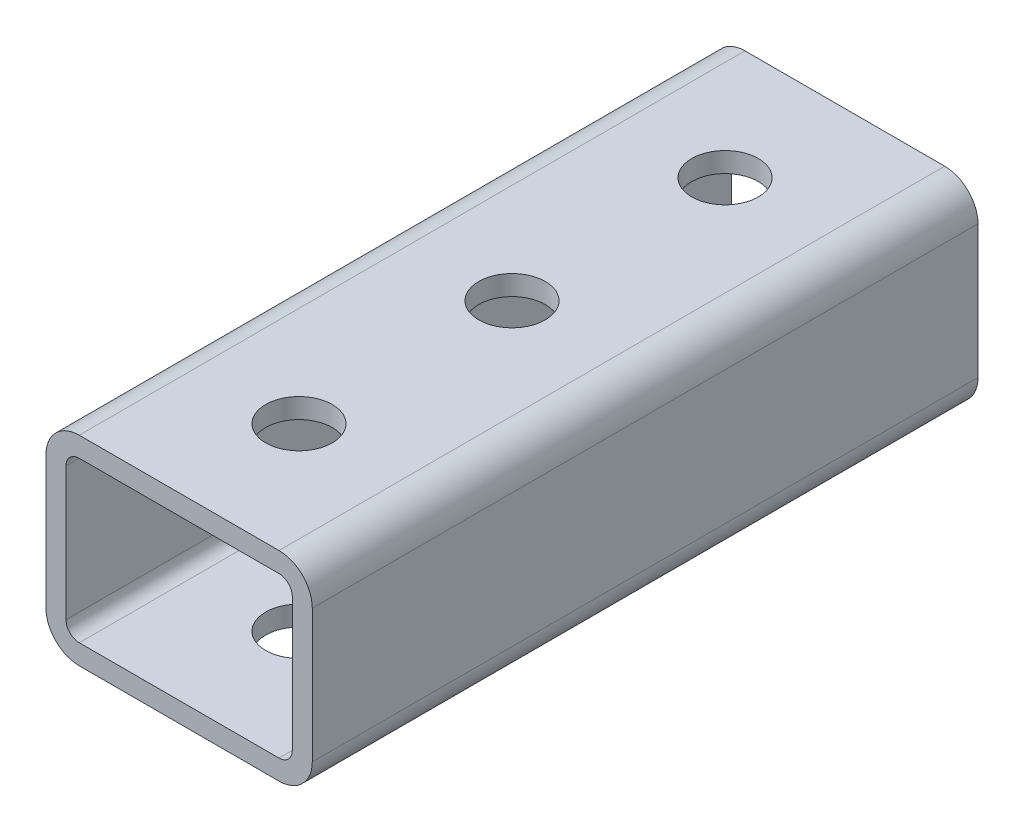
ISO-10303-21;
HEADER;
FILE_DESCRIPTION(('STEP AP214'),'2;1');
FILE_NAME('part.step','',(''),(''),'','','');
FILE_SCHEMA(('AUTOMOTIVE_DESIGN { 1 0 10303 214 1 1 1 1 }'));
ENDSEC;
DATA;
#1=APPLICATION_CONTEXT('core data for automotive mechanical design processes');
#2=APPLICATION_PROTOCOL_DEFINITION('international standard','automotive_design',2000,#1);
#3=PRODUCT_CONTEXT('',#1,'mechanical');
#4=PRODUCT('Part','Part','',(#3));
#5=PRODUCT_RELATED_PRODUCT_CATEGORY('part','',(#4));
#6=PRODUCT_DEFINITION_FORMATION('','',#4);
#7=PRODUCT_DEFINITION_CONTEXT('part definition',#1,'design');
#8=PRODUCT_DEFINITION('design','',#6,#7);
#9=PRODUCT_DEFINITION_SHAPE('','',#8);
#10=(LENGTH_UNIT() NAMED_UNIT(*) SI_UNIT(.MILLI.,.METRE.));
#11=(NAMED_UNIT(*) PLANE_ANGLE_UNIT() SI_UNIT($,.RADIAN.));
#12=(NAMED_UNIT(*) SI_UNIT($,.STERADIAN.) SOLID_ANGLE_UNIT());
#13=UNCERTAINTY_MEASURE_WITH_UNIT(LENGTH_MEASURE(1.E-05),#10,'distance_accuracy_value','');
#14=(GEOMETRIC_REPRESENTATION_CONTEXT(3) GLOBAL_UNCERTAINTY_ASSIGNED_CONTEXT((#13)) GLOBAL_UNIT_ASSIGNED_CONTEXT((#10,
#11,#12)) REPRESENTATION_CONTEXT('',''));
#15=CARTESIAN_POINT('',(0.,0.,0.));
#16=DIRECTION('',(0.,0.,1.));
#17=DIRECTION('',(1.,0.,0.));
#18=AXIS2_PLACEMENT_3D('',#15,#16,#17);
#19=CARTESIAN_POINT('',(10.,-40.9016994374947,9.));
#20=DIRECTION('',(0.,1.,0.));
#21=DIRECTION('',(-1.,0.,0.));
#22=AXIS2_PLACEMENT_3D('',#19,#20,#21);
#23=CYLINDRICAL_SURFACE('',#22,2.5);
#24=CARTESIAN_POINT('',(10.,1.5,9.));
#25=DIRECTION('',(0.,1.,0.));
#26=DIRECTION('',(-1.,0.,0.));
#27=AXIS2_PLACEMENT_3D('',#24,#25,#26);
#28=CIRCLE('',#27,2.5);
#29=CARTESIAN_POINT('',(7.50000000000001,1.5,9.));
#30=VERTEX_POINT('',#29);
#31=EDGE_CURVE('E225',#30,#30,#28,.T.);
#32=ORIENTED_EDGE('',*,*,#31,.T.);
#33=EDGE_LOOP('',(#32));
#34=FACE_BOUND('',#33,.T.);
#35=CARTESIAN_POINT('',(10.,0.,9.));
#36=DIRECTION('',(0.,1.,0.));
#37=DIRECTION('',(-1.,0.,0.));
#38=AXIS2_PLACEMENT_3D('',#35,#36,#37);
#39=CIRCLE('',#38,2.5);
#40=CARTESIAN_POINT('',(7.50000000000001,0.,9.));
#41=VERTEX_POINT('',#40);
#42=EDGE_CURVE('E228',#41,#41,#39,.T.);
#43=ORIENTED_EDGE('',*,*,#42,.F.);
#44=EDGE_LOOP('',(#43));
#45=FACE_BOUND('',#44,.T.);
#46=ADVANCED_FACE('F17',(#34,#45),#23,.F.);
#47=CARTESIAN_POINT('',(10.,-40.9016994374947,25.));
#48=DIRECTION('',(0.,1.,0.));
#49=DIRECTION('',(-1.,0.,0.));
#50=AXIS2_PLACEMENT_3D('',#47,#48,#49);
#51=CYLINDRICAL_SURFACE('',#50,2.5);
#52=CARTESIAN_POINT('',(10.,1.5,25.));
#53=DIRECTION('',(0.,1.,0.));
#54=DIRECTION('',(-1.,0.,0.));
#55=AXIS2_PLACEMENT_3D('',#52,#53,#54);
#56=CIRCLE('',#55,2.5);
#57=CARTESIAN_POINT('',(7.50000000000001,1.5,25.));
#58=VERTEX_POINT('',#57);
#59=EDGE_CURVE('E273',#58,#58,#56,.T.);
#60=ORIENTED_EDGE('',*,*,#59,.T.);
#61=EDGE_LOOP('',(#60));
#62=FACE_BOUND('',#61,.T.);
#63=CARTESIAN_POINT('',(10.,0.,25.));
#64=DIRECTION('',(0.,1.,0.));
#65=DIRECTION('',(-1.,0.,0.));
#66=AXIS2_PLACEMENT_3D('',#63,#64,#65);
#67=CIRCLE('',#66,2.5);
#68=CARTESIAN_POINT('',(7.50000000000001,0.,25.));
#69=VERTEX_POINT('',#68);
#70=EDGE_CURVE('E280',#69,#69,#67,.T.);
#71=ORIENTED_EDGE('',*,*,#70,.F.);
#72=EDGE_LOOP('',(#71));
#73=FACE_BOUND('',#72,.T.);
#74=ADVANCED_FACE('F473',(#62,#73),#51,.F.);
#75=CARTESIAN_POINT('',(10.,-40.9016994374947,41.));
#76=DIRECTION('',(0.,1.,0.));
#77=DIRECTION('',(-1.,0.,0.));
#78=AXIS2_PLACEMENT_3D('',#75,#76,#77);
#79=CYLINDRICAL_SURFACE('',#78,2.5);
#80=CARTESIAN_POINT('',(10.,1.5,41.));
#81=DIRECTION('',(0.,1.,0.));
#82=DIRECTION('',(-1.,0.,0.));
#83=AXIS2_PLACEMENT_3D('',#80,#81,#82);
#84=CIRCLE('',#83,2.5);
#85=CARTESIAN_POINT('',(7.50000000000001,1.5,41.));
#86=VERTEX_POINT('',#85);
#87=EDGE_CURVE('E146',#86,#86,#84,.T.);
#88=ORIENTED_EDGE('',*,*,#87,.T.);
#89=EDGE_LOOP('',(#88));
#90=FACE_BOUND('',#89,.T.);
#91=CARTESIAN_POINT('',(10.,0.,41.));
#92=DIRECTION('',(0.,1.,0.));
#93=DIRECTION('',(-1.,0.,0.));
#94=AXIS2_PLACEMENT_3D('',#91,#92,#93);
#95=CIRCLE('',#94,2.5);
#96=CARTESIAN_POINT('',(7.50000000000001,0.,41.));
#97=VERTEX_POINT('',#96);
#98=EDGE_CURVE('E223',#97,#97,#95,.T.);
#99=ORIENTED_EDGE('',*,*,#98,.F.);
#100=EDGE_LOOP('',(#99));
#101=FACE_BOUND('',#100,.T.);
#102=ADVANCED_FACE('F466',(#90,#101),#79,.F.);
#103=CARTESIAN_POINT('',(2.50000000000001,2.5,0.));
#104=DIRECTION('',(0.,0.,1.));
#105=DIRECTION('',(1.,0.,0.));
#106=AXIS2_PLACEMENT_3D('',#103,#104,#105);
#107=CYLINDRICAL_SURFACE('',#106,1.);
#108=DIRECTION('',(0.,0.,1.));
#109=VECTOR('',#108,1.);
#110=CARTESIAN_POINT('',(1.50000000000001,2.5,0.));
#111=LINE('',#110,#109);
#112=CARTESIAN_POINT('',(1.50000000000001,2.5,0.));
#113=VERTEX_POINT('',#112);
#114=CARTESIAN_POINT('',(1.50000000000001,2.5,50.));
#115=VERTEX_POINT('',#114);
#116=EDGE_CURVE('E140',#113,#115,#111,.T.);
#117=ORIENTED_EDGE('',*,*,#116,.T.);
#118=CARTESIAN_POINT('',(2.50000000000001,2.5,50.));
#119=DIRECTION('',(0.,0.,1.));
#120=DIRECTION('',(1.,0.,0.));
#121=AXIS2_PLACEMENT_3D('',#118,#119,#120);
#122=CIRCLE('',#121,1.);
#123=CARTESIAN_POINT('',(2.50000000000001,1.5,50.));
#124=VERTEX_POINT('',#123);
#125=EDGE_CURVE('E20',#124,#115,#122,.F.);
#126=ORIENTED_EDGE('',*,*,#125,.F.);
#127=DIRECTION('',(0.,0.,-1.));
#128=VECTOR('',#127,1.);
#129=CARTESIAN_POINT('',(2.50000000000001,1.5,0.));
#130=LINE('',#129,#128);
#131=CARTESIAN_POINT('',(2.50000000000001,1.5,0.));
#132=VERTEX_POINT('',#131);
#133=EDGE_CURVE('E222',#124,#132,#130,.T.);
#134=ORIENTED_EDGE('',*,*,#133,.T.);
#135=CARTESIAN_POINT('',(2.50000000000001,2.5,0.));
#136=DIRECTION('',(0.,0.,1.));
#137=DIRECTION('',(1.,0.,0.));
#138=AXIS2_PLACEMENT_3D('',#135,#136,#137);
#139=CIRCLE('',#138,1.);
#140=EDGE_CURVE('E138',#113,#132,#139,.T.);
#141=ORIENTED_EDGE('',*,*,#140,.F.);
#142=EDGE_LOOP('',(#117,#126,#134,#141));
#143=FACE_BOUND('',#142,.T.);
#144=ADVANCED_FACE('F141',(#143),#107,.F.);
#145=CARTESIAN_POINT('',(17.5,2.5,0.));
#146=DIRECTION('',(0.,0.,1.));
#147=DIRECTION('',(1.,0.,0.));
#148=AXIS2_PLACEMENT_3D('',#145,#146,#147);
#149=CYLINDRICAL_SURFACE('',#148,1.);
#150=DIRECTION('',(0.,0.,-1.));
#151=VECTOR('',#150,1.);
#152=CARTESIAN_POINT('',(17.5,1.5,0.));
#153=LINE('',#152,#151);
#154=CARTESIAN_POINT('',(17.5,1.5,0.));
#155=VERTEX_POINT('',#154);
#156=CARTESIAN_POINT('',(17.5,1.5,50.));
#157=VERTEX_POINT('',#156);
#158=EDGE_CURVE('E219',#155,#157,#153,.F.);
#159=ORIENTED_EDGE('',*,*,#158,.T.);
#160=CARTESIAN_POINT('',(17.5,2.5,50.));
#161=DIRECTION('',(0.,0.,1.));
#162=DIRECTION('',(1.,0.,0.));
#163=AXIS2_PLACEMENT_3D('',#160,#161,#162);
#164=CIRCLE('',#163,1.);
#165=CARTESIAN_POINT('',(18.5,2.5,50.));
#166=VERTEX_POINT('',#165);
#167=EDGE_CURVE('E286',#166,#157,#164,.F.);
#168=ORIENTED_EDGE('',*,*,#167,.F.);
#169=DIRECTION('',(0.,0.,-1.));
#170=VECTOR('',#169,1.);
#171=CARTESIAN_POINT('',(18.5,2.5,0.));
#172=LINE('',#171,#170);
#173=CARTESIAN_POINT('',(18.5,2.5,0.));
#174=VERTEX_POINT('',#173);
#175=EDGE_CURVE('E145',#166,#174,#172,.T.);
#176=ORIENTED_EDGE('',*,*,#175,.T.);
#177=CARTESIAN_POINT('',(17.5,2.5,0.));
#178=DIRECTION('',(0.,0.,1.));
#179=DIRECTION('',(1.,0.,0.));
#180=AXIS2_PLACEMENT_3D('',#177,#178,#179);
#181=CIRCLE('',#180,1.);
#182=EDGE_CURVE('E240',#155,#174,#181,.T.);
#183=ORIENTED_EDGE('',*,*,#182,.F.);
#184=EDGE_LOOP('',(#159,#168,#176,#183));
#185=FACE_BOUND('',#184,.T.);
#186=ADVANCED_FACE('F295',(#185),#149,.F.);
#187=CARTESIAN_POINT('',(17.5,2.5,0.));
#188=DIRECTION('',(0.,0.,1.));
#189=DIRECTION('',(1.,0.,0.));
#190=AXIS2_PLACEMENT_3D('',#187,#188,#189);
#191=CYLINDRICAL_SURFACE('',#190,2.5);
#192=CARTESIAN_POINT('',(17.5,2.5,0.));
#193=DIRECTION('',(0.,0.,1.));
#194=DIRECTION('',(1.,0.,0.));
#195=AXIS2_PLACEMENT_3D('',#192,#193,#194);
#196=CIRCLE('',#195,2.5);
#197=CARTESIAN_POINT('',(17.5,0.,0.));
#198=VERTEX_POINT('',#197);
#199=CARTESIAN_POINT('',(20.,2.5,0.));
#200=VERTEX_POINT('',#199);
#201=EDGE_CURVE('E193',#198,#200,#196,.T.);
#202=ORIENTED_EDGE('',*,*,#201,.T.);
#203=DIRECTION('',(0.,0.,-1.));
#204=VECTOR('',#203,1.);
#205=CARTESIAN_POINT('',(20.,2.5,0.));
#206=LINE('',#205,#204);
#207=CARTESIAN_POINT('',(20.,2.5,50.));
#208=VERTEX_POINT('',#207);
#209=EDGE_CURVE('E239',#208,#200,#206,.T.);
#210=ORIENTED_EDGE('',*,*,#209,.F.);
#211=CARTESIAN_POINT('',(17.5,2.5,50.));
#212=DIRECTION('',(0.,0.,1.));
#213=DIRECTION('',(1.,0.,0.));
#214=AXIS2_PLACEMENT_3D('',#211,#212,#213);
#215=CIRCLE('',#214,2.5);
#216=CARTESIAN_POINT('',(17.5,0.,50.));
#217=VERTEX_POINT('',#216);
#218=EDGE_CURVE('E171',#217,#208,#215,.T.);
#219=ORIENTED_EDGE('',*,*,#218,.F.);
#220=DIRECTION('',(0.,0.,-1.));
#221=VECTOR('',#220,1.);
#222=CARTESIAN_POINT('',(17.5,0.,0.));
#223=LINE('',#222,#221);
#224=EDGE_CURVE('E229',#198,#217,#223,.F.);
#225=ORIENTED_EDGE('',*,*,#224,.F.);
#226=EDGE_LOOP('',(#202,#210,#219,#225));
#227=FACE_BOUND('',#226,.T.);
#228=ADVANCED_FACE('F445',(#227),#191,.T.);
#229=CARTESIAN_POINT('',(20.,15.,0.));
#230=DIRECTION('',(1.,0.,0.));
#231=DIRECTION('',(0.,0.,-1.));
#232=AXIS2_PLACEMENT_3D('',#229,#230,#231);
#233=PLANE('',#232);
#234=DIRECTION('',(0.,0.,1.));
#235=VECTOR('',#234,1.);
#236=CARTESIAN_POINT('',(20.,12.5,0.));
#237=LINE('',#236,#235);
#238=CARTESIAN_POINT('',(20.,12.5,50.));
#239=VERTEX_POINT('',#238);
#240=CARTESIAN_POINT('',(20.,12.5,0.));
#241=VERTEX_POINT('',#240);
#242=EDGE_CURVE('E235',#239,#241,#237,.F.);
#243=ORIENTED_EDGE('',*,*,#242,.F.);
#244=DIRECTION('',(0.,1.,0.));
#245=VECTOR('',#244,1.);
#246=CARTESIAN_POINT('',(20.,7.5,50.));
#247=LINE('',#246,#245);
#248=EDGE_CURVE('E169',#208,#239,#247,.T.);
#249=ORIENTED_EDGE('',*,*,#248,.F.);
#250=ORIENTED_EDGE('',*,*,#209,.T.);
#251=DIRECTION('',(0.,1.,0.));
#252=VECTOR('',#251,1.);
#253=CARTESIAN_POINT('',(20.,7.5,0.));
#254=LINE('',#253,#252);
#255=EDGE_CURVE('E206',#200,#241,#254,.T.);
#256=ORIENTED_EDGE('',*,*,#255,.T.);
#257=EDGE_LOOP('',(#243,#249,#250,#256));
#258=FACE_BOUND('',#257,.T.);
#259=ADVANCED_FACE('F437',(#258),#233,.T.);
#260=CARTESIAN_POINT('',(17.5,12.5,0.));
#261=DIRECTION('',(0.,0.,1.));
#262=DIRECTION('',(1.,0.,0.));
#263=AXIS2_PLACEMENT_3D('',#260,#261,#262);
#264=CYLINDRICAL_SURFACE('',#263,2.5);
#265=CARTESIAN_POINT('',(17.5,12.5,0.));
#266=DIRECTION('',(0.,0.,1.));
#267=DIRECTION('',(1.,0.,0.));
#268=AXIS2_PLACEMENT_3D('',#265,#266,#267);
#269=CIRCLE('',#268,2.5);
#270=CARTESIAN_POINT('',(17.5,15.,0.));
#271=VERTEX_POINT('',#270);
#272=EDGE_CURVE('E205',#241,#271,#269,.T.);
#273=ORIENTED_EDGE('',*,*,#272,.T.);
#274=DIRECTION('',(0.,0.,1.));
#275=VECTOR('',#274,1.);
#276=CARTESIAN_POINT('',(17.5,15.,0.));
#277=LINE('',#276,#275);
#278=CARTESIAN_POINT('',(17.5,15.,50.));
#279=VERTEX_POINT('',#278);
#280=EDGE_CURVE('E216',#279,#271,#277,.F.);
#281=ORIENTED_EDGE('',*,*,#280,.F.);
#282=CARTESIAN_POINT('',(17.5,12.5,50.));
#283=DIRECTION('',(0.,0.,1.));
#284=DIRECTION('',(1.,0.,0.));
#285=AXIS2_PLACEMENT_3D('',#282,#283,#284);
#286=CIRCLE('',#285,2.5);
#287=EDGE_CURVE('E168',#239,#279,#286,.T.);
#288=ORIENTED_EDGE('',*,*,#287,.F.);
#289=ORIENTED_EDGE('',*,*,#242,.T.);
#290=EDGE_LOOP('',(#273,#281,#288,#289));
#291=FACE_BOUND('',#290,.T.);
#292=ADVANCED_FACE('F429',(#291),#264,.T.);
#293=CARTESIAN_POINT('',(2.5,12.5,0.));
#294=DIRECTION('',(0.,0.,1.));
#295=DIRECTION('',(1.,0.,0.));
#296=AXIS2_PLACEMENT_3D('',#293,#294,#295);
#297=CYLINDRICAL_SURFACE('',#296,2.5);
#298=CARTESIAN_POINT('',(2.5,12.5,0.));
#299=DIRECTION('',(0.,0.,1.));
#300=DIRECTION('',(1.,0.,0.));
#301=AXIS2_PLACEMENT_3D('',#298,#299,#300);
#302=CIRCLE('',#301,2.5);
#303=CARTESIAN_POINT('',(2.5,15.,0.));
#304=VERTEX_POINT('',#303);
#305=CARTESIAN_POINT('',(0.,12.5,0.));
#306=VERTEX_POINT('',#305);
#307=EDGE_CURVE('E201',#304,#306,#302,.T.);
#308=ORIENTED_EDGE('',*,*,#307,.T.);
#309=DIRECTION('',(0.,0.,1.));
#310=VECTOR('',#309,1.);
#311=CARTESIAN_POINT('',(0.,12.5,0.));
#312=LINE('',#311,#310);
#313=CARTESIAN_POINT('',(0.,12.5,50.));
#314=VERTEX_POINT('',#313);
#315=EDGE_CURVE('E233',#314,#306,#312,.F.);
#316=ORIENTED_EDGE('',*,*,#315,.F.);
#317=CARTESIAN_POINT('',(2.5,12.5,50.));
#318=DIRECTION('',(0.,0.,1.));
#319=DIRECTION('',(1.,0.,0.));
#320=AXIS2_PLACEMENT_3D('',#317,#318,#319);
#321=CIRCLE('',#320,2.5);
#322=CARTESIAN_POINT('',(2.5,15.,50.));
#323=VERTEX_POINT('',#322);
#324=EDGE_CURVE('E164',#323,#314,#321,.T.);
#325=ORIENTED_EDGE('',*,*,#324,.F.);
#326=DIRECTION('',(0.,0.,1.));
#327=VECTOR('',#326,1.);
#328=CARTESIAN_POINT('',(2.5,15.,0.));
#329=LINE('',#328,#327);
#330=EDGE_CURVE('E209',#304,#323,#329,.T.);
#331=ORIENTED_EDGE('',*,*,#330,.F.);
#332=EDGE_LOOP('',(#308,#316,#325,#331));
#333=FACE_BOUND('',#332,.T.);
#334=ADVANCED_FACE('F421',(#333),#297,.T.);
#335=CARTESIAN_POINT('',(0.,0.,0.));
#336=DIRECTION('',(-1.,0.,0.));
#337=DIRECTION('',(0.,0.,1.));
#338=AXIS2_PLACEMENT_3D('',#335,#336,#337);
#339=PLANE('',#338);
#340=ORIENTED_EDGE('',*,*,#315,.T.);
#341=DIRECTION('',(0.,1.,0.));
#342=VECTOR('',#341,1.);
#343=CARTESIAN_POINT('',(0.,7.5,0.));
#344=LINE('',#343,#342);
#345=CARTESIAN_POINT('',(0.,2.5,0.));
#346=VERTEX_POINT('',#345);
#347=EDGE_CURVE('E198',#306,#346,#344,.F.);
#348=ORIENTED_EDGE('',*,*,#347,.T.);
#349=DIRECTION('',(0.,0.,1.));
#350=VECTOR('',#349,1.);
#351=CARTESIAN_POINT('',(0.,2.5,0.));
#352=LINE('',#351,#350);
#353=CARTESIAN_POINT('',(0.,2.5,50.));
#354=VERTEX_POINT('',#353);
#355=EDGE_CURVE('E231',#354,#346,#352,.F.);
#356=ORIENTED_EDGE('',*,*,#355,.F.);
#357=DIRECTION('',(0.,1.,0.));
#358=VECTOR('',#357,1.);
#359=CARTESIAN_POINT('',(0.,7.5,50.));
#360=LINE('',#359,#358);
#361=EDGE_CURVE('E162',#314,#354,#360,.F.);
#362=ORIENTED_EDGE('',*,*,#361,.F.);
#363=EDGE_LOOP('',(#340,#348,#356,#362));
#364=FACE_BOUND('',#363,.T.);
#365=ADVANCED_FACE('F413',(#364),#339,.T.);
#366=CARTESIAN_POINT('',(2.5,2.5,0.));
#367=DIRECTION('',(0.,0.,1.));
#368=DIRECTION('',(1.,0.,0.));
#369=AXIS2_PLACEMENT_3D('',#366,#367,#368);
#370=CYLINDRICAL_SURFACE('',#369,2.5);
#371=CARTESIAN_POINT('',(2.5,2.5,0.));
#372=DIRECTION('',(0.,0.,1.));
#373=DIRECTION('',(1.,0.,0.));
#374=AXIS2_PLACEMENT_3D('',#371,#372,#373);
#375=CIRCLE('',#374,2.5);
#376=CARTESIAN_POINT('',(2.5,0.,0.));
#377=VERTEX_POINT('',#376);
#378=EDGE_CURVE('E197',#346,#377,#375,.T.);
#379=ORIENTED_EDGE('',*,*,#378,.T.);
#380=DIRECTION('',(0.,0.,-1.));
#381=VECTOR('',#380,1.);
#382=CARTESIAN_POINT('',(2.5,0.,0.));
#383=LINE('',#382,#381);
#384=CARTESIAN_POINT('',(2.5,0.,50.));
#385=VERTEX_POINT('',#384);
#386=EDGE_CURVE('E226',#385,#377,#383,.T.);
#387=ORIENTED_EDGE('',*,*,#386,.F.);
#388=CARTESIAN_POINT('',(2.5,2.5,50.));
#389=DIRECTION('',(0.,0.,1.));
#390=DIRECTION('',(1.,0.,0.));
#391=AXIS2_PLACEMENT_3D('',#388,#389,#390);
#392=CIRCLE('',#391,2.5);
#393=EDGE_CURVE('E161',#354,#385,#392,.T.);
#394=ORIENTED_EDGE('',*,*,#393,.F.);
#395=ORIENTED_EDGE('',*,*,#355,.T.);
#396=EDGE_LOOP('',(#379,#387,#394,#395));
#397=FACE_BOUND('',#396,.T.);
#398=ADVANCED_FACE('F405',(#397),#370,.T.);
#399=CARTESIAN_POINT('',(20.,0.,0.));
#400=DIRECTION('',(0.,-1.,0.));
#401=DIRECTION('',(0.,0.,-1.));
#402=AXIS2_PLACEMENT_3D('',#399,#400,#401);
#403=PLANE('',#402);
#404=ORIENTED_EDGE('',*,*,#98,.T.);
#405=EDGE_LOOP('',(#404));
#406=FACE_BOUND('',#405,.T.);
#407=ORIENTED_EDGE('',*,*,#70,.T.);
#408=EDGE_LOOP('',(#407));
#409=FACE_BOUND('',#408,.T.);
#410=ORIENTED_EDGE('',*,*,#42,.T.);
#411=EDGE_LOOP('',(#410));
#412=FACE_BOUND('',#411,.T.);
#413=ORIENTED_EDGE('',*,*,#386,.T.);
#414=DIRECTION('',(1.,0.,0.));
#415=VECTOR('',#414,1.);
#416=CARTESIAN_POINT('',(10.,0.,0.));
#417=LINE('',#416,#415);
#418=EDGE_CURVE('E194',#377,#198,#417,.T.);
#419=ORIENTED_EDGE('',*,*,#418,.T.);
#420=ORIENTED_EDGE('',*,*,#224,.T.);
#421=DIRECTION('',(1.,0.,0.));
#422=VECTOR('',#421,1.);
#423=CARTESIAN_POINT('',(10.,0.,50.));
#424=LINE('',#423,#422);
#425=EDGE_CURVE('E155',#385,#217,#424,.T.);
#426=ORIENTED_EDGE('',*,*,#425,.F.);
#427=EDGE_LOOP('',(#413,#419,#420,#426));
#428=FACE_BOUND('',#427,.T.);
#429=ADVANCED_FACE('F397',(#406,#409,#412,#428),#403,.T.);
#430=CARTESIAN_POINT('',(18.5,1.5,0.));
#431=DIRECTION('',(0.,-1.,0.));
#432=DIRECTION('',(0.,0.,-1.));
#433=AXIS2_PLACEMENT_3D('',#430,#431,#432);
#434=PLANE('',#433);
#435=ORIENTED_EDGE('',*,*,#87,.F.);
#436=EDGE_LOOP('',(#435));
#437=FACE_BOUND('',#436,.T.);
#438=ORIENTED_EDGE('',*,*,#59,.F.);
#439=EDGE_LOOP('',(#438));
#440=FACE_BOUND('',#439,.T.);
#441=ORIENTED_EDGE('',*,*,#31,.F.);
#442=EDGE_LOOP('',(#441));
#443=FACE_BOUND('',#442,.T.);
#444=DIRECTION('',(1.,0.,0.));
#445=VECTOR('',#444,1.);
#446=CARTESIAN_POINT('',(10.,1.5,50.));
#447=LINE('',#446,#445);
#448=EDGE_CURVE('E137',#157,#124,#447,.F.);
#449=ORIENTED_EDGE('',*,*,#448,.F.);
#450=ORIENTED_EDGE('',*,*,#158,.F.);
#451=DIRECTION('',(1.,0.,0.));
#452=VECTOR('',#451,1.);
#453=CARTESIAN_POINT('',(10.,1.5,0.));
#454=LINE('',#453,#452);
#455=EDGE_CURVE('E185',#155,#132,#454,.F.);
#456=ORIENTED_EDGE('',*,*,#455,.T.);
#457=ORIENTED_EDGE('',*,*,#133,.F.);
#458=EDGE_LOOP('',(#449,#450,#456,#457));
#459=FACE_BOUND('',#458,.T.);
#460=ADVANCED_FACE('F293',(#437,#440,#443,#459),#434,.F.);
#461=CARTESIAN_POINT('',(1.50000000000001,1.5,0.));
#462=DIRECTION('',(-1.,0.,0.));
#463=DIRECTION('',(0.,0.,1.));
#464=AXIS2_PLACEMENT_3D('',#461,#462,#463);
#465=PLANE('',#464);
#466=DIRECTION('',(0.,1.,0.));
#467=VECTOR('',#466,1.);
#468=CARTESIAN_POINT('',(1.50000000000001,7.5,50.));
#469=LINE('',#468,#467);
#470=CARTESIAN_POINT('',(1.50000000000001,12.5,50.));
#471=VERTEX_POINT('',#470);
#472=EDGE_CURVE('E134',#115,#471,#469,.T.);
#473=ORIENTED_EDGE('',*,*,#472,.F.);
#474=ORIENTED_EDGE('',*,*,#116,.F.);
#475=DIRECTION('',(0.,1.,0.));
#476=VECTOR('',#475,1.);
#477=CARTESIAN_POINT('',(1.50000000000001,7.5,0.));
#478=LINE('',#477,#476);
#479=CARTESIAN_POINT('',(1.50000000000001,12.5,0.));
#480=VERTEX_POINT('',#479);
#481=EDGE_CURVE('E191',#113,#480,#478,.T.);
#482=ORIENTED_EDGE('',*,*,#481,.T.);
#483=DIRECTION('',(0.,0.,1.));
#484=VECTOR('',#483,1.);
#485=CARTESIAN_POINT('',(1.50000000000001,12.5,0.));
#486=LINE('',#485,#484);
#487=EDGE_CURVE('E149',#480,#471,#486,.T.);
#488=ORIENTED_EDGE('',*,*,#487,.T.);
#489=EDGE_LOOP('',(#473,#474,#482,#488));
#490=FACE_BOUND('',#489,.T.);
#491=ADVANCED_FACE('F148',(#490),#465,.F.);
#492=CARTESIAN_POINT('',(18.5,13.5,0.));
#493=DIRECTION('',(1.,0.,0.));
#494=DIRECTION('',(0.,0.,-1.));
#495=AXIS2_PLACEMENT_3D('',#492,#493,#494);
#496=PLANE('',#495);
#497=DIRECTION('',(0.,1.,0.));
#498=VECTOR('',#497,1.);
#499=CARTESIAN_POINT('',(18.5,7.5,0.));
#500=LINE('',#499,#498);
#501=CARTESIAN_POINT('',(18.5,12.5,0.));
#502=VERTEX_POINT('',#501);
#503=EDGE_CURVE('E188',#502,#174,#500,.F.);
#504=ORIENTED_EDGE('',*,*,#503,.T.);
#505=ORIENTED_EDGE('',*,*,#175,.F.);
#506=DIRECTION('',(0.,1.,0.));
#507=VECTOR('',#506,1.);
#508=CARTESIAN_POINT('',(18.5,7.5,50.));
#509=LINE('',#508,#507);
#510=CARTESIAN_POINT('',(18.5,12.5,50.));
#511=VERTEX_POINT('',#510);
#512=EDGE_CURVE('E153',#511,#166,#509,.F.);
#513=ORIENTED_EDGE('',*,*,#512,.F.);
#514=DIRECTION('',(0.,0.,1.));
#515=VECTOR('',#514,1.);
#516=CARTESIAN_POINT('',(18.5,12.5,0.));
#517=LINE('',#516,#515);
#518=EDGE_CURVE('E210',#511,#502,#517,.F.);
#519=ORIENTED_EDGE('',*,*,#518,.T.);
#520=EDGE_LOOP('',(#504,#505,#513,#519));
#521=FACE_BOUND('',#520,.T.);
#522=ADVANCED_FACE('F301',(#521),#496,.F.);
#523=CARTESIAN_POINT('',(0.,15.,0.));
#524=DIRECTION('',(0.,1.,0.));
#525=DIRECTION('',(0.,0.,1.));
#526=AXIS2_PLACEMENT_3D('',#523,#524,#525);
#527=PLANE('',#526);
#528=CARTESIAN_POINT('',(10.,15.,41.));
#529=DIRECTION('',(0.,1.,0.));
#530=DIRECTION('',(-1.,0.,0.));
#531=AXIS2_PLACEMENT_3D('',#528,#529,#530);
#532=CIRCLE('',#531,2.5);
#533=CARTESIAN_POINT('',(7.5,15.,41.));
#534=VERTEX_POINT('',#533);
#535=EDGE_CURVE('E184',#534,#534,#532,.F.);
#536=ORIENTED_EDGE('',*,*,#535,.T.);
#537=EDGE_LOOP('',(#536));
#538=FACE_BOUND('',#537,.T.);
#539=CARTESIAN_POINT('',(10.,15.,25.));
#540=DIRECTION('',(0.,1.,0.));
#541=DIRECTION('',(-1.,0.,0.));
#542=AXIS2_PLACEMENT_3D('',#539,#540,#541);
#543=CIRCLE('',#542,2.5);
#544=CARTESIAN_POINT('',(7.5,15.,25.));
#545=VERTEX_POINT('',#544);
#546=EDGE_CURVE('E248',#545,#545,#543,.F.);
#547=ORIENTED_EDGE('',*,*,#546,.T.);
#548=EDGE_LOOP('',(#547));
#549=FACE_BOUND('',#548,.T.);
#550=CARTESIAN_POINT('',(10.,15.,9.));
#551=DIRECTION('',(0.,1.,0.));
#552=DIRECTION('',(-1.,0.,0.));
#553=AXIS2_PLACEMENT_3D('',#550,#551,#552);
#554=CIRCLE('',#553,2.5);
#555=CARTESIAN_POINT('',(7.5,15.,9.));
#556=VERTEX_POINT('',#555);
#557=EDGE_CURVE('E251',#556,#556,#554,.F.);
#558=ORIENTED_EDGE('',*,*,#557,.T.);
#559=EDGE_LOOP('',(#558));
#560=FACE_BOUND('',#559,.T.);
#561=ORIENTED_EDGE('',*,*,#330,.T.);
#562=DIRECTION('',(1.,0.,0.));
#563=VECTOR('',#562,1.);
#564=CARTESIAN_POINT('',(10.,15.,50.));
#565=LINE('',#564,#563);
#566=EDGE_CURVE('E165',#279,#323,#565,.F.);
#567=ORIENTED_EDGE('',*,*,#566,.F.);
#568=ORIENTED_EDGE('',*,*,#280,.T.);
#569=DIRECTION('',(1.,0.,0.));
#570=VECTOR('',#569,1.);
#571=CARTESIAN_POINT('',(10.,15.,0.));
#572=LINE('',#571,#570);
#573=EDGE_CURVE('E202',#271,#304,#572,.F.);
#574=ORIENTED_EDGE('',*,*,#573,.T.);
#575=EDGE_LOOP('',(#561,#567,#568,#574));
#576=FACE_BOUND('',#575,.T.);
#577=ADVANCED_FACE('F317',(#538,#549,#560,#576),#527,.T.);
#578=CARTESIAN_POINT('',(10.,7.5,0.));
#579=DIRECTION('',(0.,0.,1.));
#580=DIRECTION('',(1.,0.,0.));
#581=AXIS2_PLACEMENT_3D('',#578,#579,#580);
#582=PLANE('',#581);
#583=ORIENTED_EDGE('',*,*,#182,.T.);
#584=ORIENTED_EDGE('',*,*,#503,.F.);
#585=CARTESIAN_POINT('',(17.5,12.5,0.));
#586=DIRECTION('',(0.,0.,1.));
#587=DIRECTION('',(1.,0.,0.));
#588=AXIS2_PLACEMENT_3D('',#585,#586,#587);
#589=CIRCLE('',#588,1.);
#590=CARTESIAN_POINT('',(17.5,13.5,0.));
#591=VERTEX_POINT('',#590);
#592=EDGE_CURVE('E213',#502,#591,#589,.T.);
#593=ORIENTED_EDGE('',*,*,#592,.T.);
#594=DIRECTION('',(1.,0.,0.));
#595=VECTOR('',#594,1.);
#596=CARTESIAN_POINT('',(1.50000000000001,13.5,0.));
#597=LINE('',#596,#595);
#598=CARTESIAN_POINT('',(2.50000000000001,13.5,0.));
#599=VERTEX_POINT('',#598);
#600=EDGE_CURVE('E176',#591,#599,#597,.F.);
#601=ORIENTED_EDGE('',*,*,#600,.T.);
#602=CARTESIAN_POINT('',(2.50000000000001,12.5,0.));
#603=DIRECTION('',(0.,0.,1.));
#604=DIRECTION('',(1.,0.,0.));
#605=AXIS2_PLACEMENT_3D('',#602,#603,#604);
#606=CIRCLE('',#605,1.);
#607=EDGE_CURVE('E217',#599,#480,#606,.T.);
#608=ORIENTED_EDGE('',*,*,#607,.T.);
#609=ORIENTED_EDGE('',*,*,#481,.F.);
#610=ORIENTED_EDGE('',*,*,#140,.T.);
#611=ORIENTED_EDGE('',*,*,#455,.F.);
#612=EDGE_LOOP('',(#583,#584,#593,#601,#608,#609,#610,#611));
#613=FACE_BOUND('',#612,.T.);
#614=ORIENTED_EDGE('',*,*,#418,.F.);
#615=ORIENTED_EDGE('',*,*,#378,.F.);
#616=ORIENTED_EDGE('',*,*,#347,.F.);
#617=ORIENTED_EDGE('',*,*,#307,.F.);
#618=ORIENTED_EDGE('',*,*,#573,.F.);
#619=ORIENTED_EDGE('',*,*,#272,.F.);
#620=ORIENTED_EDGE('',*,*,#255,.F.);
#621=ORIENTED_EDGE('',*,*,#201,.F.);
#622=EDGE_LOOP('',(#614,#615,#616,#617,#618,#619,#620,#621));
#623=FACE_BOUND('',#622,.T.);
#624=ADVANCED_FACE('F289',(#613,#623),#582,.F.);
#625=CARTESIAN_POINT('',(2.50000000000001,12.5,0.));
#626=DIRECTION('',(0.,0.,1.));
#627=DIRECTION('',(1.,0.,0.));
#628=AXIS2_PLACEMENT_3D('',#625,#626,#627);
#629=CYLINDRICAL_SURFACE('',#628,1.);
#630=DIRECTION('',(0.,0.,1.));
#631=VECTOR('',#630,1.);
#632=CARTESIAN_POINT('',(2.50000000000001,13.5,0.));
#633=LINE('',#632,#631);
#634=CARTESIAN_POINT('',(2.50000000000001,13.5,50.));
#635=VERTEX_POINT('',#634);
#636=EDGE_CURVE('E172',#599,#635,#633,.T.);
#637=ORIENTED_EDGE('',*,*,#636,.T.);
#638=CARTESIAN_POINT('',(2.50000000000001,12.5,50.));
#639=DIRECTION('',(0.,0.,1.));
#640=DIRECTION('',(1.,0.,0.));
#641=AXIS2_PLACEMENT_3D('',#638,#639,#640);
#642=CIRCLE('',#641,1.);
#643=EDGE_CURVE('E151',#471,#635,#642,.F.);
#644=ORIENTED_EDGE('',*,*,#643,.F.);
#645=ORIENTED_EDGE('',*,*,#487,.F.);
#646=ORIENTED_EDGE('',*,*,#607,.F.);
#647=EDGE_LOOP('',(#637,#644,#645,#646));
#648=FACE_BOUND('',#647,.T.);
#649=ADVANCED_FACE('F308',(#648),#629,.F.);
#650=CARTESIAN_POINT('',(10.,7.5,50.));
#651=DIRECTION('',(0.,0.,1.));
#652=DIRECTION('',(1.,0.,0.));
#653=AXIS2_PLACEMENT_3D('',#650,#651,#652);
#654=PLANE('',#653);
#655=ORIENTED_EDGE('',*,*,#512,.T.);
#656=ORIENTED_EDGE('',*,*,#167,.T.);
#657=ORIENTED_EDGE('',*,*,#448,.T.);
#658=ORIENTED_EDGE('',*,*,#125,.T.);
#659=ORIENTED_EDGE('',*,*,#472,.T.);
#660=ORIENTED_EDGE('',*,*,#643,.T.);
#661=DIRECTION('',(1.,0.,0.));
#662=VECTOR('',#661,1.);
#663=CARTESIAN_POINT('',(1.50000000000001,13.5,50.));
#664=LINE('',#663,#662);
#665=CARTESIAN_POINT('',(17.5,13.5,50.));
#666=VERTEX_POINT('',#665);
#667=EDGE_CURVE('E175',#635,#666,#664,.T.);
#668=ORIENTED_EDGE('',*,*,#667,.T.);
#669=CARTESIAN_POINT('',(17.5,12.5,50.));
#670=DIRECTION('',(0.,0.,1.));
#671=DIRECTION('',(1.,0.,0.));
#672=AXIS2_PLACEMENT_3D('',#669,#670,#671);
#673=CIRCLE('',#672,1.);
#674=EDGE_CURVE('E35',#666,#511,#673,.F.);
#675=ORIENTED_EDGE('',*,*,#674,.T.);
#676=EDGE_LOOP('',(#655,#656,#657,#658,#659,#660,#668,#675));
#677=FACE_BOUND('',#676,.T.);
#678=ORIENTED_EDGE('',*,*,#393,.T.);
#679=ORIENTED_EDGE('',*,*,#425,.T.);
#680=ORIENTED_EDGE('',*,*,#218,.T.);
#681=ORIENTED_EDGE('',*,*,#248,.T.);
#682=ORIENTED_EDGE('',*,*,#287,.T.);
#683=ORIENTED_EDGE('',*,*,#566,.T.);
#684=ORIENTED_EDGE('',*,*,#324,.T.);
#685=ORIENTED_EDGE('',*,*,#361,.T.);
#686=EDGE_LOOP('',(#678,#679,#680,#681,#682,#683,#684,#685));
#687=FACE_BOUND('',#686,.T.);
#688=ADVANCED_FACE('F131',(#677,#687),#654,.T.);
#689=CARTESIAN_POINT('',(17.5,12.5,0.));
#690=DIRECTION('',(0.,0.,1.));
#691=DIRECTION('',(1.,0.,0.));
#692=AXIS2_PLACEMENT_3D('',#689,#690,#691);
#693=CYLINDRICAL_SURFACE('',#692,1.);
#694=ORIENTED_EDGE('',*,*,#518,.F.);
#695=ORIENTED_EDGE('',*,*,#674,.F.);
#696=DIRECTION('',(0.,0.,1.));
#697=VECTOR('',#696,1.);
#698=CARTESIAN_POINT('',(17.5,13.5,0.));
#699=LINE('',#698,#697);
#700=EDGE_CURVE('E179',#666,#591,#699,.F.);
#701=ORIENTED_EDGE('',*,*,#700,.T.);
#702=ORIENTED_EDGE('',*,*,#592,.F.);
#703=EDGE_LOOP('',(#694,#695,#701,#702));
#704=FACE_BOUND('',#703,.T.);
#705=ADVANCED_FACE('F300',(#704),#693,.F.);
#706=CARTESIAN_POINT('',(10.,-40.9016994374947,9.));
#707=DIRECTION('',(0.,1.,0.));
#708=DIRECTION('',(-1.,0.,0.));
#709=AXIS2_PLACEMENT_3D('',#706,#707,#708);
#710=CYLINDRICAL_SURFACE('',#709,2.5);
#711=ORIENTED_EDGE('',*,*,#557,.F.);
#712=EDGE_LOOP('',(#711));
#713=FACE_BOUND('',#712,.T.);
#714=CARTESIAN_POINT('',(10.,13.5,9.));
#715=DIRECTION('',(0.,1.,0.));
#716=DIRECTION('',(-1.,0.,0.));
#717=AXIS2_PLACEMENT_3D('',#714,#715,#716);
#718=CIRCLE('',#717,2.5);
#719=CARTESIAN_POINT('',(7.5,13.5,9.));
#720=VERTEX_POINT('',#719);
#721=EDGE_CURVE('E181',#720,#720,#718,.F.);
#722=ORIENTED_EDGE('',*,*,#721,.T.);
#723=EDGE_LOOP('',(#722));
#724=FACE_BOUND('',#723,.T.);
#725=ADVANCED_FACE('F334',(#713,#724),#710,.F.);
#726=CARTESIAN_POINT('',(10.,-40.9016994374947,25.));
#727=DIRECTION('',(0.,1.,0.));
#728=DIRECTION('',(-1.,0.,0.));
#729=AXIS2_PLACEMENT_3D('',#726,#727,#728);
#730=CYLINDRICAL_SURFACE('',#729,2.5);
#731=ORIENTED_EDGE('',*,*,#546,.F.);
#732=EDGE_LOOP('',(#731));
#733=FACE_BOUND('',#732,.T.);
#734=CARTESIAN_POINT('',(10.,13.5,25.));
#735=DIRECTION('',(0.,1.,0.));
#736=DIRECTION('',(-1.,0.,0.));
#737=AXIS2_PLACEMENT_3D('',#734,#735,#736);
#738=CIRCLE('',#737,2.5);
#739=CARTESIAN_POINT('',(7.5,13.5,25.));
#740=VERTEX_POINT('',#739);
#741=EDGE_CURVE('E26',#740,#740,#738,.F.);
#742=ORIENTED_EDGE('',*,*,#741,.T.);
#743=EDGE_LOOP('',(#742));
#744=FACE_BOUND('',#743,.T.);
#745=ADVANCED_FACE('F326',(#733,#744),#730,.F.);
#746=CARTESIAN_POINT('',(10.,-40.9016994374947,41.));
#747=DIRECTION('',(0.,1.,0.));
#748=DIRECTION('',(-1.,0.,0.));
#749=AXIS2_PLACEMENT_3D('',#746,#747,#748);
#750=CYLINDRICAL_SURFACE('',#749,2.5);
#751=ORIENTED_EDGE('',*,*,#535,.F.);
#752=EDGE_LOOP('',(#751));
#753=FACE_BOUND('',#752,.T.);
#754=CARTESIAN_POINT('',(10.,13.5,41.));
#755=DIRECTION('',(0.,1.,0.));
#756=DIRECTION('',(-1.,0.,0.));
#757=AXIS2_PLACEMENT_3D('',#754,#755,#756);
#758=CIRCLE('',#757,2.5);
#759=CARTESIAN_POINT('',(7.5,13.5,41.));
#760=VERTEX_POINT('',#759);
#761=EDGE_CURVE('E11',#760,#760,#758,.F.);
#762=ORIENTED_EDGE('',*,*,#761,.T.);
#763=EDGE_LOOP('',(#762));
#764=FACE_BOUND('',#763,.T.);
#765=ADVANCED_FACE('F320',(#753,#764),#750,.F.);
#766=CARTESIAN_POINT('',(1.50000000000001,13.5,0.));
#767=DIRECTION('',(0.,1.,0.));
#768=DIRECTION('',(0.,0.,1.));
#769=AXIS2_PLACEMENT_3D('',#766,#767,#768);
#770=PLANE('',#769);
#771=ORIENTED_EDGE('',*,*,#761,.F.);
#772=EDGE_LOOP('',(#771));
#773=FACE_BOUND('',#772,.T.);
#774=ORIENTED_EDGE('',*,*,#741,.F.);
#775=EDGE_LOOP('',(#774));
#776=FACE_BOUND('',#775,.T.);
#777=ORIENTED_EDGE('',*,*,#721,.F.);
#778=EDGE_LOOP('',(#777));
#779=FACE_BOUND('',#778,.T.);
#780=ORIENTED_EDGE('',*,*,#667,.F.);
#781=ORIENTED_EDGE('',*,*,#636,.F.);
#782=ORIENTED_EDGE('',*,*,#600,.F.);
#783=ORIENTED_EDGE('',*,*,#700,.F.);
#784=EDGE_LOOP('',(#780,#781,#782,#783));
#785=FACE_BOUND('',#784,.T.);
#786=ADVANCED_FACE('F305',(#773,#776,#779,#785),#770,.F.);
#787=CLOSED_SHELL('',(#46,#74,#102,#144,#186,#228,#259,#292,#334,#365,#398,#429,#460,#491,#522,
#577,#624,#649,#688,#705,#725,#745,#765,#786));
#788=MANIFOLD_SOLID_BREP('B1',#787);
#789=ADVANCED_BREP_SHAPE_REPRESENTATION('',(#18,#788),#14);
#790=SHAPE_DEFINITION_REPRESENTATION(#9,#789);
ENDSEC;
END-ISO-10303-21;
